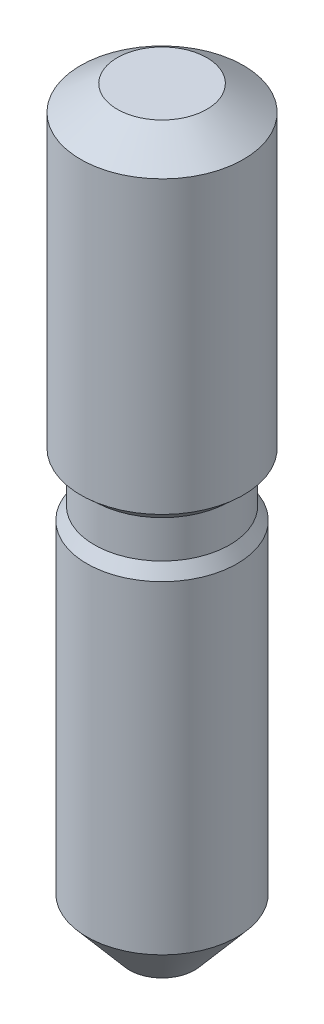
ISO-10303-21;
HEADER;
FILE_DESCRIPTION(('STEP AP214'),'2;1');
FILE_NAME('part.step','',(''),(''),'','','');
FILE_SCHEMA(('AUTOMOTIVE_DESIGN { 1 0 10303 214 1 1 1 1 }'));
ENDSEC;
DATA;
#1=APPLICATION_CONTEXT('core data for automotive mechanical design processes');
#2=APPLICATION_PROTOCOL_DEFINITION('international standard','automotive_design',2000,#1);
#3=PRODUCT_CONTEXT('',#1,'mechanical');
#4=PRODUCT('Part','Part','',(#3));
#5=PRODUCT_RELATED_PRODUCT_CATEGORY('part','',(#4));
#6=PRODUCT_DEFINITION_FORMATION('','',#4);
#7=PRODUCT_DEFINITION_CONTEXT('part definition',#1,'design');
#8=PRODUCT_DEFINITION('design','',#6,#7);
#9=PRODUCT_DEFINITION_SHAPE('','',#8);
#10=(LENGTH_UNIT() NAMED_UNIT(*) SI_UNIT(.MILLI.,.METRE.));
#11=(NAMED_UNIT(*) PLANE_ANGLE_UNIT() SI_UNIT($,.RADIAN.));
#12=(NAMED_UNIT(*) SI_UNIT($,.STERADIAN.) SOLID_ANGLE_UNIT());
#13=UNCERTAINTY_MEASURE_WITH_UNIT(LENGTH_MEASURE(1.E-05),#10,'distance_accuracy_value','');
#14=(GEOMETRIC_REPRESENTATION_CONTEXT(3) GLOBAL_UNCERTAINTY_ASSIGNED_CONTEXT((#13)) GLOBAL_UNIT_ASSIGNED_CONTEXT((#10,
#11,#12)) REPRESENTATION_CONTEXT('',''));
#15=CARTESIAN_POINT('',(0.,0.,0.));
#16=DIRECTION('',(0.,0.,1.));
#17=DIRECTION('',(1.,0.,0.));
#18=AXIS2_PLACEMENT_3D('',#15,#16,#17);
#19=CARTESIAN_POINT('',(0.,0.,0.));
#20=DIRECTION('',(0.,1.,0.));
#21=DIRECTION('',(0.,0.,1.));
#22=AXIS2_PLACEMENT_3D('',#19,#20,#21);
#23=PLANE('',#22);
#24=CARTESIAN_POINT('',(0.,0.,0.));
#25=DIRECTION('',(0.,-1.,0.));
#26=DIRECTION('',(0.,0.,-1.));
#27=AXIS2_PLACEMENT_3D('',#24,#25,#26);
#28=CIRCLE('',#27,3.575);
#29=CARTESIAN_POINT('',(0.,0.,-3.575));
#30=VERTEX_POINT('',#29);
#31=EDGE_CURVE('E10',#30,#30,#28,.T.);
#32=ORIENTED_EDGE('',*,*,#31,.F.);
#33=EDGE_LOOP('',(#32));
#34=FACE_BOUND('',#33,.T.);
#35=ADVANCED_FACE('F31',(#34),#23,.T.);
#36=CARTESIAN_POINT('',(0.,-2.,0.));
#37=DIRECTION('',(0.,-1.,0.));
#38=DIRECTION('',(0.,0.,-1.));
#39=AXIS2_PLACEMENT_3D('',#36,#37,#38);
#40=CONICAL_SURFACE('',#39,6.5,0.971052579825473);
#41=ORIENTED_EDGE('',*,*,#31,.T.);
#42=EDGE_LOOP('',(#41));
#43=FACE_BOUND('',#42,.T.);
#44=CARTESIAN_POINT('',(0.,-2.,0.));
#45=DIRECTION('',(0.,-1.,0.));
#46=DIRECTION('',(0.,0.,-1.));
#47=AXIS2_PLACEMENT_3D('',#44,#45,#46);
#48=CIRCLE('',#47,6.5);
#49=CARTESIAN_POINT('',(0.,-2.,-6.5));
#50=VERTEX_POINT('',#49);
#51=EDGE_CURVE('E37',#50,#50,#48,.T.);
#52=ORIENTED_EDGE('',*,*,#51,.F.);
#53=EDGE_LOOP('',(#52));
#54=FACE_BOUND('',#53,.T.);
#55=ADVANCED_FACE('F79',(#43,#54),#40,.T.);
#56=CARTESIAN_POINT('',(0.,-64.,0.));
#57=DIRECTION('',(0.,-1.,0.));
#58=DIRECTION('',(0.,0.,-1.));
#59=AXIS2_PLACEMENT_3D('',#56,#57,#58);
#60=CYLINDRICAL_SURFACE('',#59,6.5);
#61=ORIENTED_EDGE('',*,*,#51,.T.);
#62=EDGE_LOOP('',(#61));
#63=FACE_BOUND('',#62,.T.);
#64=CARTESIAN_POINT('',(0.,-25.2,0.));
#65=DIRECTION('',(0.,-1.,0.));
#66=DIRECTION('',(0.,0.,-1.));
#67=AXIS2_PLACEMENT_3D('',#64,#65,#66);
#68=CIRCLE('',#67,6.5);
#69=CARTESIAN_POINT('',(0.,-25.2,-6.5));
#70=VERTEX_POINT('',#69);
#71=EDGE_CURVE('E41',#70,#70,#68,.T.);
#72=ORIENTED_EDGE('',*,*,#71,.F.);
#73=EDGE_LOOP('',(#72));
#74=FACE_BOUND('',#73,.T.);
#75=ADVANCED_FACE('F84',(#63,#74),#60,.T.);
#76=CARTESIAN_POINT('',(0.,-26.2,0.));
#77=DIRECTION('',(0.,1.,0.));
#78=DIRECTION('',(0.,0.,1.));
#79=AXIS2_PLACEMENT_3D('',#76,#77,#78);
#80=CONICAL_SURFACE('',#79,5.4,0.832981266674431);
#81=ORIENTED_EDGE('',*,*,#71,.T.);
#82=EDGE_LOOP('',(#81));
#83=FACE_BOUND('',#82,.T.);
#84=CARTESIAN_POINT('',(0.,-26.2,0.));
#85=DIRECTION('',(0.,-1.,0.));
#86=DIRECTION('',(0.,0.,-1.));
#87=AXIS2_PLACEMENT_3D('',#84,#85,#86);
#88=CIRCLE('',#87,5.4);
#89=CARTESIAN_POINT('',(0.,-26.2,-5.4));
#90=VERTEX_POINT('',#89);
#91=EDGE_CURVE('E45',#90,#90,#88,.T.);
#92=ORIENTED_EDGE('',*,*,#91,.F.);
#93=EDGE_LOOP('',(#92));
#94=FACE_BOUND('',#93,.T.);
#95=ADVANCED_FACE('F88',(#83,#94),#80,.T.);
#96=CARTESIAN_POINT('',(0.,-64.,0.));
#97=DIRECTION('',(0.,-1.,0.));
#98=DIRECTION('',(0.,0.,-1.));
#99=AXIS2_PLACEMENT_3D('',#96,#97,#98);
#100=CYLINDRICAL_SURFACE('',#99,5.4);
#101=ORIENTED_EDGE('',*,*,#91,.T.);
#102=EDGE_LOOP('',(#101));
#103=FACE_BOUND('',#102,.T.);
#104=CARTESIAN_POINT('',(0.,-29.2,0.));
#105=DIRECTION('',(0.,-1.,0.));
#106=DIRECTION('',(0.,0.,-1.));
#107=AXIS2_PLACEMENT_3D('',#104,#105,#106);
#108=CIRCLE('',#107,5.4);
#109=CARTESIAN_POINT('',(0.,-29.2,-5.4));
#110=VERTEX_POINT('',#109);
#111=EDGE_CURVE('E50',#110,#110,#108,.T.);
#112=ORIENTED_EDGE('',*,*,#111,.F.);
#113=EDGE_LOOP('',(#112));
#114=FACE_BOUND('',#113,.T.);
#115=ADVANCED_FACE('F94',(#103,#114),#100,.T.);
#116=CARTESIAN_POINT('',(0.,-30.2,0.));
#117=DIRECTION('',(0.,-1.,0.));
#118=DIRECTION('',(0.,0.,-1.));
#119=AXIS2_PLACEMENT_3D('',#116,#117,#118);
#120=CONICAL_SURFACE('',#119,6.,0.540419500270583);
#121=ORIENTED_EDGE('',*,*,#111,.T.);
#122=EDGE_LOOP('',(#121));
#123=FACE_BOUND('',#122,.T.);
#124=CARTESIAN_POINT('',(0.,-30.2,0.));
#125=DIRECTION('',(0.,-1.,0.));
#126=DIRECTION('',(0.,0.,-1.));
#127=AXIS2_PLACEMENT_3D('',#124,#125,#126);
#128=CIRCLE('',#127,6.);
#129=CARTESIAN_POINT('',(0.,-30.2,-6.));
#130=VERTEX_POINT('',#129);
#131=EDGE_CURVE('E53',#130,#130,#128,.T.);
#132=ORIENTED_EDGE('',*,*,#131,.F.);
#133=EDGE_LOOP('',(#132));
#134=FACE_BOUND('',#133,.T.);
#135=ADVANCED_FACE('F75',(#123,#134),#120,.T.);
#136=CARTESIAN_POINT('',(0.,-64.,0.));
#137=DIRECTION('',(0.,-1.,0.));
#138=DIRECTION('',(0.,0.,-1.));
#139=AXIS2_PLACEMENT_3D('',#136,#137,#138);
#140=CYLINDRICAL_SURFACE('',#139,6.);
#141=ORIENTED_EDGE('',*,*,#131,.T.);
#142=EDGE_LOOP('',(#141));
#143=FACE_BOUND('',#142,.T.);
#144=CARTESIAN_POINT('',(0.,-56.,0.));
#145=DIRECTION('',(0.,-1.,0.));
#146=DIRECTION('',(0.,0.,-1.));
#147=AXIS2_PLACEMENT_3D('',#144,#145,#146);
#148=CIRCLE('',#147,6.);
#149=CARTESIAN_POINT('',(0.,-56.,-6.));
#150=VERTEX_POINT('',#149);
#151=EDGE_CURVE('E56',#150,#150,#148,.T.);
#152=ORIENTED_EDGE('',*,*,#151,.F.);
#153=EDGE_LOOP('',(#152));
#154=FACE_BOUND('',#153,.T.);
#155=ADVANCED_FACE('F67',(#143,#154),#140,.T.);
#156=CARTESIAN_POINT('',(0.,-60.,0.));
#157=DIRECTION('',(0.,1.,0.));
#158=DIRECTION('',(0.,0.,1.));
#159=AXIS2_PLACEMENT_3D('',#156,#157,#158);
#160=CONICAL_SURFACE('',#159,2.6,0.704494064242218);
#161=ORIENTED_EDGE('',*,*,#151,.T.);
#162=EDGE_LOOP('',(#161));
#163=FACE_BOUND('',#162,.T.);
#164=CARTESIAN_POINT('',(0.,-60.,0.));
#165=DIRECTION('',(0.,-1.,0.));
#166=DIRECTION('',(0.,0.,-1.));
#167=AXIS2_PLACEMENT_3D('',#164,#165,#166);
#168=CIRCLE('',#167,2.6);
#169=CARTESIAN_POINT('',(0.,-60.,-2.6));
#170=VERTEX_POINT('',#169);
#171=EDGE_CURVE('E59',#170,#170,#168,.T.);
#172=ORIENTED_EDGE('',*,*,#171,.F.);
#173=EDGE_LOOP('',(#172));
#174=FACE_BOUND('',#173,.T.);
#175=ADVANCED_FACE('F65',(#163,#174),#160,.T.);
#176=CARTESIAN_POINT('',(2.6,-60.,0.));
#177=DIRECTION('',(0.,-1.,0.));
#178=DIRECTION('',(0.,0.,-1.));
#179=AXIS2_PLACEMENT_3D('',#176,#177,#178);
#180=PLANE('',#179);
#181=ORIENTED_EDGE('',*,*,#171,.T.);
#182=EDGE_LOOP('',(#181));
#183=FACE_BOUND('',#182,.T.);
#184=ADVANCED_FACE('F63',(#183),#180,.T.);
#185=CLOSED_SHELL('',(#35,#55,#75,#95,#115,#135,#155,#175,#184));
#186=MANIFOLD_SOLID_BREP('B2',#185);
#187=ADVANCED_BREP_SHAPE_REPRESENTATION('',(#18,#186),#14);
#188=SHAPE_DEFINITION_REPRESENTATION(#9,#187);
ENDSEC;
END-ISO-10303-21;
